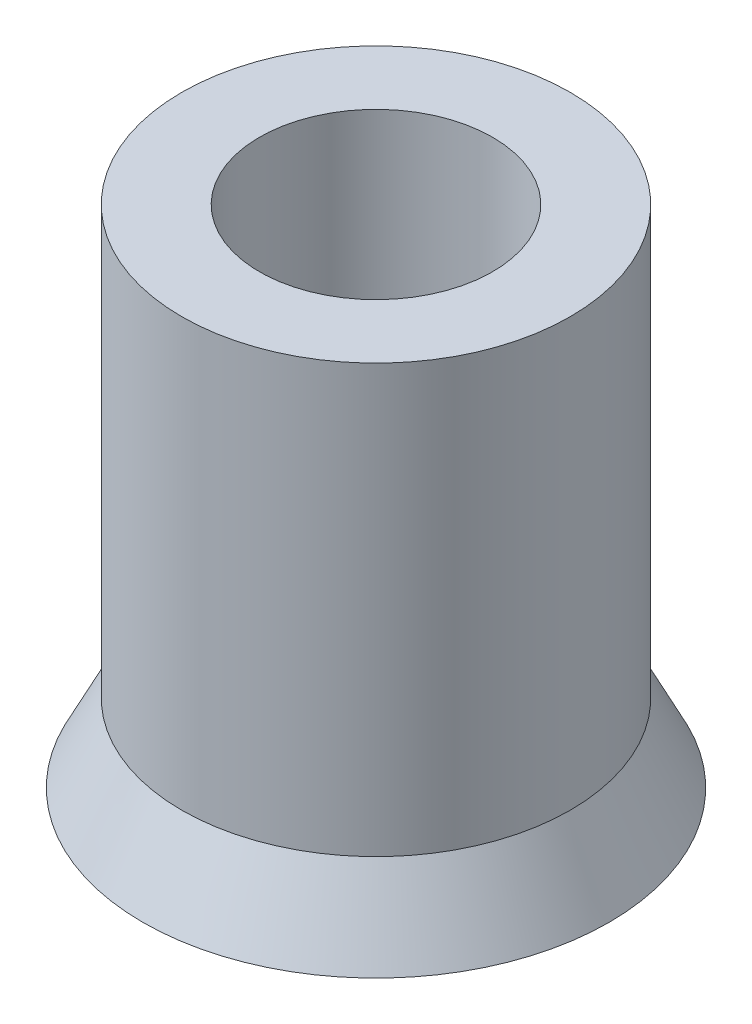
ISO-10303-21;
HEADER;
FILE_DESCRIPTION(('STEP AP214'),'2;1');
FILE_NAME('part.step','',(''),(''),'','','');
FILE_SCHEMA(('AUTOMOTIVE_DESIGN { 1 0 10303 214 1 1 1 1 }'));
ENDSEC;
DATA;
#1=APPLICATION_CONTEXT('core data for automotive mechanical design processes');
#2=APPLICATION_PROTOCOL_DEFINITION('international standard','automotive_design',2000,#1);
#3=PRODUCT_CONTEXT('',#1,'mechanical');
#4=PRODUCT('Part','Part','',(#3));
#5=PRODUCT_RELATED_PRODUCT_CATEGORY('part','',(#4));
#6=PRODUCT_DEFINITION_FORMATION('','',#4);
#7=PRODUCT_DEFINITION_CONTEXT('part definition',#1,'design');
#8=PRODUCT_DEFINITION('design','',#6,#7);
#9=PRODUCT_DEFINITION_SHAPE('','',#8);
#10=(LENGTH_UNIT() NAMED_UNIT(*) SI_UNIT(.MILLI.,.METRE.));
#11=(NAMED_UNIT(*) PLANE_ANGLE_UNIT() SI_UNIT($,.RADIAN.));
#12=(NAMED_UNIT(*) SI_UNIT($,.STERADIAN.) SOLID_ANGLE_UNIT());
#13=UNCERTAINTY_MEASURE_WITH_UNIT(LENGTH_MEASURE(1.E-05),#10,'distance_accuracy_value','');
#14=(GEOMETRIC_REPRESENTATION_CONTEXT(3) GLOBAL_UNCERTAINTY_ASSIGNED_CONTEXT((#13)) GLOBAL_UNIT_ASSIGNED_CONTEXT((#10,
#11,#12)) REPRESENTATION_CONTEXT('',''));
#15=CARTESIAN_POINT('',(0.,0.,0.));
#16=DIRECTION('',(0.,0.,1.));
#17=DIRECTION('',(1.,0.,0.));
#18=AXIS2_PLACEMENT_3D('',#15,#16,#17);
#19=CARTESIAN_POINT('',(0.,13.,0.));
#20=DIRECTION('',(0.,-1.,0.));
#21=DIRECTION('',(0.,0.,-1.));
#22=AXIS2_PLACEMENT_3D('',#19,#20,#21);
#23=CYLINDRICAL_SURFACE('',#22,3.);
#24=CARTESIAN_POINT('',(0.,13.,0.));
#25=DIRECTION('',(0.,1.,0.));
#26=DIRECTION('',(0.,0.,1.));
#27=AXIS2_PLACEMENT_3D('',#24,#25,#26);
#28=CIRCLE('',#27,3.);
#29=CARTESIAN_POINT('',(0.,13.,-3.));
#30=VERTEX_POINT('',#29);
#31=EDGE_CURVE('E48',#30,#30,#28,.T.);
#32=CARTESIAN_POINT('',(0.,0.,0.));
#33=DIRECTION('',(0.,1.,0.));
#34=DIRECTION('',(0.,0.,1.));
#35=AXIS2_PLACEMENT_3D('',#32,#33,#34);
#36=CIRCLE('',#35,3.);
#37=CARTESIAN_POINT('',(0.,0.,-3.));
#38=VERTEX_POINT('',#37);
#39=EDGE_CURVE('E44',#38,#38,#36,.T.);
#40=CARTESIAN_POINT('',(0.,13.,-3.));
#41=CARTESIAN_POINT('',(0.,12.8645833333333,-3.));
#42=CARTESIAN_POINT('',(0.,12.7291666666667,-3.));
#43=CARTESIAN_POINT('',(0.,12.4583333333333,-3.));
#44=CARTESIAN_POINT('',(0.,12.3229166666667,-3.));
#45=CARTESIAN_POINT('',(0.,12.0520833333333,-3.));
#46=CARTESIAN_POINT('',(0.,11.9166666666667,-3.));
#47=CARTESIAN_POINT('',(0.,11.6458333333333,-3.));
#48=CARTESIAN_POINT('',(0.,11.5104166666667,-3.));
#49=CARTESIAN_POINT('',(0.,11.2395833333333,-3.));
#50=CARTESIAN_POINT('',(0.,11.1041666666667,-3.));
#51=CARTESIAN_POINT('',(0.,10.8333333333333,-3.));
#52=CARTESIAN_POINT('',(0.,10.6979166666667,-3.));
#53=CARTESIAN_POINT('',(0.,10.4270833333333,-3.));
#54=CARTESIAN_POINT('',(0.,10.2916666666667,-3.));
#55=CARTESIAN_POINT('',(0.,10.0208333333333,-3.));
#56=CARTESIAN_POINT('',(0.,9.88541666666667,-3.));
#57=CARTESIAN_POINT('',(0.,9.61458333333333,-3.));
#58=CARTESIAN_POINT('',(0.,9.47916666666667,-3.));
#59=CARTESIAN_POINT('',(0.,9.20833333333333,-3.));
#60=CARTESIAN_POINT('',(0.,9.07291666666667,-3.));
#61=CARTESIAN_POINT('',(0.,8.80208333333333,-3.));
#62=CARTESIAN_POINT('',(0.,8.66666666666667,-3.));
#63=CARTESIAN_POINT('',(0.,8.39583333333333,-3.));
#64=CARTESIAN_POINT('',(0.,8.26041666666667,-3.));
#65=CARTESIAN_POINT('',(0.,7.98958333333333,-3.));
#66=CARTESIAN_POINT('',(0.,7.85416666666667,-3.));
#67=CARTESIAN_POINT('',(0.,7.58333333333333,-3.));
#68=CARTESIAN_POINT('',(0.,7.44791666666667,-3.));
#69=CARTESIAN_POINT('',(0.,7.17708333333333,-3.));
#70=CARTESIAN_POINT('',(0.,7.04166666666667,-3.));
#71=CARTESIAN_POINT('',(0.,6.77083333333333,-3.));
#72=CARTESIAN_POINT('',(0.,6.63541666666667,-3.));
#73=CARTESIAN_POINT('',(0.,6.36458333333333,-3.));
#74=CARTESIAN_POINT('',(0.,6.22916666666667,-3.));
#75=CARTESIAN_POINT('',(0.,5.95833333333333,-3.));
#76=CARTESIAN_POINT('',(0.,5.82291666666667,-3.));
#77=CARTESIAN_POINT('',(0.,5.55208333333333,-3.));
#78=CARTESIAN_POINT('',(0.,5.41666666666667,-3.));
#79=CARTESIAN_POINT('',(0.,5.14583333333333,-3.));
#80=CARTESIAN_POINT('',(0.,5.01041666666667,-3.));
#81=CARTESIAN_POINT('',(0.,4.73958333333333,-3.));
#82=CARTESIAN_POINT('',(0.,4.60416666666667,-3.));
#83=CARTESIAN_POINT('',(0.,4.33333333333333,-3.));
#84=CARTESIAN_POINT('',(0.,4.19791666666667,-3.));
#85=CARTESIAN_POINT('',(0.,3.92708333333333,-3.));
#86=CARTESIAN_POINT('',(0.,3.79166666666667,-3.));
#87=CARTESIAN_POINT('',(0.,3.52083333333333,-3.));
#88=CARTESIAN_POINT('',(0.,3.38541666666667,-3.));
#89=CARTESIAN_POINT('',(0.,3.11458333333333,-3.));
#90=CARTESIAN_POINT('',(0.,2.97916666666667,-3.));
#91=CARTESIAN_POINT('',(0.,2.70833333333333,-3.));
#92=CARTESIAN_POINT('',(0.,2.57291666666667,-3.));
#93=CARTESIAN_POINT('',(0.,2.30208333333333,-3.));
#94=CARTESIAN_POINT('',(0.,2.16666666666667,-3.));
#95=CARTESIAN_POINT('',(0.,1.89583333333333,-3.));
#96=CARTESIAN_POINT('',(0.,1.76041666666667,-3.));
#97=CARTESIAN_POINT('',(0.,1.48958333333333,-3.));
#98=CARTESIAN_POINT('',(0.,1.35416666666667,-3.));
#99=CARTESIAN_POINT('',(0.,1.08333333333333,-3.));
#100=CARTESIAN_POINT('',(0.,0.947916666666667,-3.));
#101=CARTESIAN_POINT('',(0.,0.677083333333334,-3.));
#102=CARTESIAN_POINT('',(0.,0.541666666666667,-3.));
#103=CARTESIAN_POINT('',(0.,0.270833333333334,-3.));
#104=CARTESIAN_POINT('',(0.,0.135416666666667,-3.));
#105=CARTESIAN_POINT('',(0.,0.,-3.));
#106=B_SPLINE_CURVE_WITH_KNOTS('',3,(#40,#41,#42,#43,#44,#45,#46,#47,#48,#49,#50,#51,#52,#53,
#54,#55,#56,#57,#58,#59,#60,#61,#62,#63,#64,#65,#66,#67,#68,#69,#70,#71,#72,#73,#74,#75,#76,#77,
#78,#79,#80,#81,#82,#83,#84,#85,#86,#87,#88,#89,#90,#91,#92,#93,#94,#95,#96,#97,#98,#99,#100,
#101,#102,#103,#104,#105),.UNSPECIFIED.,.F.,.F.,(4,2,2,2,2,2,2,2,2,2,2,2,2,2,2,2,2,2,2,2,2,2,2,
2,2,2,2,2,2,2,2,2,4),(0.,0.406249999999999,0.812499999999999,1.21875,1.625,2.03125,2.4375,
2.84375,3.25,3.65625,4.0625,4.46875,4.875,5.28125,5.6875,6.09375,6.5,6.90625,7.3125,7.71875,
8.125,8.53125,8.9375,9.34375,9.75,10.15625,10.5625,10.96875,11.375,11.78125,12.1875,12.59375,
13.),.UNSPECIFIED.);
#107=EDGE_CURVE('BSEAM39',#30,#38,#106,.T.);
#108=ORIENTED_EDGE('',*,*,#31,.T.);
#109=ORIENTED_EDGE('',*,*,#39,.F.);
#110=ORIENTED_EDGE('',*,*,#107,.T.);
#111=ORIENTED_EDGE('',*,*,#107,.F.);
#112=EDGE_LOOP('',(#108,#110,#109,#111));
#113=FACE_BOUND('',#112,.T.);
#114=ADVANCED_FACE('F39',(#113),#23,.F.);
#115=CARTESIAN_POINT('',(0.,13.,0.));
#116=DIRECTION('',(0.,-1.,0.));
#117=DIRECTION('',(0.,0.,-1.));
#118=AXIS2_PLACEMENT_3D('',#115,#116,#117);
#119=CYLINDRICAL_SURFACE('',#118,5.);
#120=CARTESIAN_POINT('',(0.,2.,0.));
#121=DIRECTION('',(0.,1.,0.));
#122=DIRECTION('',(0.,0.,1.));
#123=AXIS2_PLACEMENT_3D('',#120,#121,#122);
#124=CIRCLE('',#123,5.);
#125=CARTESIAN_POINT('',(0.,2.,-5.));
#126=VERTEX_POINT('',#125);
#127=EDGE_CURVE('E57',#126,#126,#124,.T.);
#128=CARTESIAN_POINT('',(0.,13.,0.));
#129=DIRECTION('',(0.,1.,0.));
#130=DIRECTION('',(0.,0.,1.));
#131=AXIS2_PLACEMENT_3D('',#128,#129,#130);
#132=CIRCLE('',#131,5.);
#133=CARTESIAN_POINT('',(0.,13.,-5.));
#134=VERTEX_POINT('',#133);
#135=EDGE_CURVE('E10',#134,#134,#132,.T.);
#136=CARTESIAN_POINT('',(0.,2.,-5.));
#137=CARTESIAN_POINT('',(0.,2.11458333333333,-5.));
#138=CARTESIAN_POINT('',(0.,2.22916666666667,-5.));
#139=CARTESIAN_POINT('',(0.,2.45833333333333,-5.));
#140=CARTESIAN_POINT('',(0.,2.57291666666667,-5.));
#141=CARTESIAN_POINT('',(0.,2.80208333333333,-5.));
#142=CARTESIAN_POINT('',(0.,2.91666666666667,-5.));
#143=CARTESIAN_POINT('',(0.,3.14583333333333,-5.));
#144=CARTESIAN_POINT('',(0.,3.26041666666666,-5.));
#145=CARTESIAN_POINT('',(0.,3.48958333333333,-5.));
#146=CARTESIAN_POINT('',(0.,3.60416666666666,-5.));
#147=CARTESIAN_POINT('',(0.,3.83333333333333,-5.));
#148=CARTESIAN_POINT('',(0.,3.94791666666666,-5.));
#149=CARTESIAN_POINT('',(0.,4.17708333333333,-5.));
#150=CARTESIAN_POINT('',(0.,4.29166666666667,-5.));
#151=CARTESIAN_POINT('',(0.,4.52083333333333,-5.));
#152=CARTESIAN_POINT('',(0.,4.63541666666667,-5.));
#153=CARTESIAN_POINT('',(0.,4.86458333333333,-5.));
#154=CARTESIAN_POINT('',(0.,4.97916666666666,-5.));
#155=CARTESIAN_POINT('',(0.,5.20833333333333,-5.));
#156=CARTESIAN_POINT('',(0.,5.32291666666666,-5.));
#157=CARTESIAN_POINT('',(0.,5.55208333333333,-5.));
#158=CARTESIAN_POINT('',(0.,5.66666666666666,-5.));
#159=CARTESIAN_POINT('',(0.,5.89583333333333,-5.));
#160=CARTESIAN_POINT('',(0.,6.01041666666666,-5.));
#161=CARTESIAN_POINT('',(0.,6.23958333333333,-5.));
#162=CARTESIAN_POINT('',(0.,6.35416666666666,-5.));
#163=CARTESIAN_POINT('',(0.,6.58333333333333,-5.));
#164=CARTESIAN_POINT('',(0.,6.69791666666666,-5.));
#165=CARTESIAN_POINT('',(0.,6.92708333333333,-5.));
#166=CARTESIAN_POINT('',(0.,7.04166666666667,-5.));
#167=CARTESIAN_POINT('',(0.,7.27083333333333,-5.));
#168=CARTESIAN_POINT('',(0.,7.38541666666666,-5.));
#169=CARTESIAN_POINT('',(0.,7.61458333333333,-5.));
#170=CARTESIAN_POINT('',(0.,7.72916666666666,-5.));
#171=CARTESIAN_POINT('',(0.,7.95833333333333,-5.));
#172=CARTESIAN_POINT('',(0.,8.07291666666666,-5.));
#173=CARTESIAN_POINT('',(0.,8.30208333333333,-5.));
#174=CARTESIAN_POINT('',(0.,8.41666666666666,-5.));
#175=CARTESIAN_POINT('',(0.,8.64583333333333,-5.));
#176=CARTESIAN_POINT('',(0.,8.76041666666666,-5.));
#177=CARTESIAN_POINT('',(0.,8.98958333333333,-5.));
#178=CARTESIAN_POINT('',(0.,9.10416666666666,-5.));
#179=CARTESIAN_POINT('',(0.,9.33333333333333,-5.));
#180=CARTESIAN_POINT('',(0.,9.44791666666667,-5.));
#181=CARTESIAN_POINT('',(0.,9.67708333333333,-5.));
#182=CARTESIAN_POINT('',(0.,9.79166666666666,-5.));
#183=CARTESIAN_POINT('',(0.,10.0208333333333,-5.));
#184=CARTESIAN_POINT('',(0.,10.1354166666667,-5.));
#185=CARTESIAN_POINT('',(0.,10.3645833333333,-5.));
#186=CARTESIAN_POINT('',(0.,10.4791666666667,-5.));
#187=CARTESIAN_POINT('',(0.,10.7083333333333,-5.));
#188=CARTESIAN_POINT('',(0.,10.8229166666667,-5.));
#189=CARTESIAN_POINT('',(0.,11.0520833333333,-5.));
#190=CARTESIAN_POINT('',(0.,11.1666666666667,-5.));
#191=CARTESIAN_POINT('',(0.,11.3958333333333,-5.));
#192=CARTESIAN_POINT('',(0.,11.5104166666667,-5.));
#193=CARTESIAN_POINT('',(0.,11.7395833333333,-5.));
#194=CARTESIAN_POINT('',(0.,11.8541666666667,-5.));
#195=CARTESIAN_POINT('',(0.,12.0833333333333,-5.));
#196=CARTESIAN_POINT('',(0.,12.1979166666667,-5.));
#197=CARTESIAN_POINT('',(0.,12.4270833333333,-5.));
#198=CARTESIAN_POINT('',(0.,12.5416666666667,-5.));
#199=CARTESIAN_POINT('',(0.,12.7708333333333,-5.));
#200=CARTESIAN_POINT('',(0.,12.8854166666667,-5.));
#201=CARTESIAN_POINT('',(0.,13.,-5.));
#202=B_SPLINE_CURVE_WITH_KNOTS('',3,(#136,#137,#138,#139,#140,#141,#142,#143,#144,#145,#146,
#147,#148,#149,#150,#151,#152,#153,#154,#155,#156,#157,#158,#159,#160,#161,#162,#163,#164,#165,
#166,#167,#168,#169,#170,#171,#172,#173,#174,#175,#176,#177,#178,#179,#180,#181,#182,#183,#184,
#185,#186,#187,#188,#189,#190,#191,#192,#193,#194,#195,#196,#197,#198,#199,#200,#201),
.UNSPECIFIED.,.F.,.F.,(4,2,2,2,2,2,2,2,2,2,2,2,2,2,2,2,2,2,2,2,2,2,2,2,2,2,2,2,2,2,2,2,4),(0.,
0.34375,0.687500000000001,1.03125,1.375,1.71875,2.0625,2.40625,2.75,3.09375,3.4375,3.78125,
4.125,4.46875,4.8125,5.15625,5.5,5.84375,6.1875,6.53125,6.875,7.21875,7.5625,7.90625,8.25,
8.59375,8.9375,9.28125,9.625,9.96875,10.3125,10.65625,11.),.UNSPECIFIED.);
#203=EDGE_CURVE('BSEAM68',#126,#134,#202,.T.);
#204=ORIENTED_EDGE('',*,*,#127,.T.);
#205=ORIENTED_EDGE('',*,*,#135,.F.);
#206=ORIENTED_EDGE('',*,*,#203,.T.);
#207=ORIENTED_EDGE('',*,*,#203,.F.);
#208=EDGE_LOOP('',(#204,#206,#205,#207));
#209=FACE_BOUND('',#208,.T.);
#210=ADVANCED_FACE('F68',(#209),#119,.T.);
#211=CARTESIAN_POINT('',(0.,13.,0.));
#212=DIRECTION('',(0.,1.,0.));
#213=DIRECTION('',(0.,0.,1.));
#214=AXIS2_PLACEMENT_3D('',#211,#212,#213);
#215=PLANE('',#214);
#216=ORIENTED_EDGE('',*,*,#31,.F.);
#217=EDGE_LOOP('',(#216));
#218=FACE_BOUND('',#217,.T.);
#219=ORIENTED_EDGE('',*,*,#135,.T.);
#220=EDGE_LOOP('',(#219));
#221=FACE_BOUND('',#220,.T.);
#222=ADVANCED_FACE('F73',(#218,#221),#215,.T.);
#223=CARTESIAN_POINT('',(0.,0.,0.));
#224=DIRECTION('',(0.,1.,0.));
#225=DIRECTION('',(0.,0.,1.));
#226=AXIS2_PLACEMENT_3D('',#223,#224,#225);
#227=PLANE('',#226);
#228=ORIENTED_EDGE('',*,*,#39,.T.);
#229=EDGE_LOOP('',(#228));
#230=FACE_BOUND('',#229,.T.);
#231=CARTESIAN_POINT('',(0.,0.,0.));
#232=DIRECTION('',(0.,1.,0.));
#233=DIRECTION('',(0.,0.,1.));
#234=AXIS2_PLACEMENT_3D('',#231,#232,#233);
#235=CIRCLE('',#234,6.);
#236=CARTESIAN_POINT('',(0.,0.,6.));
#237=VERTEX_POINT('',#236);
#238=EDGE_CURVE('E54',#237,#237,#235,.T.);
#239=ORIENTED_EDGE('',*,*,#238,.F.);
#240=EDGE_LOOP('',(#239));
#241=FACE_BOUND('',#240,.T.);
#242=ADVANCED_FACE('F64',(#230,#241),#227,.F.);
#243=CARTESIAN_POINT('',(0.,2.,0.));
#244=DIRECTION('',(0.,-1.,0.));
#245=DIRECTION('',(0.,0.,-1.));
#246=AXIS2_PLACEMENT_3D('',#243,#244,#245);
#247=CONICAL_SURFACE('',#246,5.,0.463647609000804);
#248=ORIENTED_EDGE('',*,*,#238,.T.);
#249=EDGE_LOOP('',(#248));
#250=FACE_BOUND('',#249,.T.);
#251=ORIENTED_EDGE('',*,*,#127,.F.);
#252=EDGE_LOOP('',(#251));
#253=FACE_BOUND('',#252,.T.);
#254=ADVANCED_FACE('F42',(#250,#253),#247,.T.);
#255=CLOSED_SHELL('',(#114,#210,#222,#242,#254));
#256=MANIFOLD_SOLID_BREP('B2',#255);
#257=ADVANCED_BREP_SHAPE_REPRESENTATION('',(#18,#256),#14);
#258=SHAPE_DEFINITION_REPRESENTATION(#9,#257);
ENDSEC;
END-ISO-10303-21;
